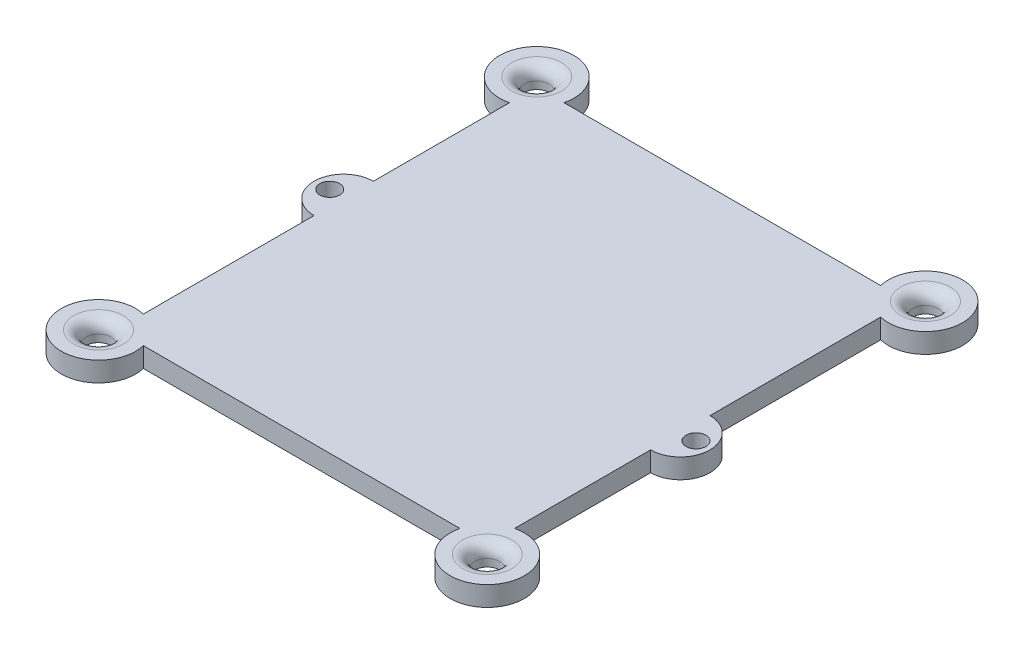
ISO-10303-21;
HEADER;
FILE_DESCRIPTION(('STEP AP214'),'2;1');
FILE_NAME('part.step','',(''),(''),'','','');
FILE_SCHEMA(('AUTOMOTIVE_DESIGN { 1 0 10303 214 1 1 1 1 }'));
ENDSEC;
DATA;
#1=APPLICATION_CONTEXT('core data for automotive mechanical design processes');
#2=APPLICATION_PROTOCOL_DEFINITION('international standard','automotive_design',2000,#1);
#3=PRODUCT_CONTEXT('',#1,'mechanical');
#4=PRODUCT('Part','Part','',(#3));
#5=PRODUCT_RELATED_PRODUCT_CATEGORY('part','',(#4));
#6=PRODUCT_DEFINITION_FORMATION('','',#4);
#7=PRODUCT_DEFINITION_CONTEXT('part definition',#1,'design');
#8=PRODUCT_DEFINITION('design','',#6,#7);
#9=PRODUCT_DEFINITION_SHAPE('','',#8);
#10=(LENGTH_UNIT() NAMED_UNIT(*) SI_UNIT(.MILLI.,.METRE.));
#11=(NAMED_UNIT(*) PLANE_ANGLE_UNIT() SI_UNIT($,.RADIAN.));
#12=(NAMED_UNIT(*) SI_UNIT($,.STERADIAN.) SOLID_ANGLE_UNIT());
#13=UNCERTAINTY_MEASURE_WITH_UNIT(LENGTH_MEASURE(1.E-05),#10,'distance_accuracy_value','');
#14=(GEOMETRIC_REPRESENTATION_CONTEXT(3) GLOBAL_UNCERTAINTY_ASSIGNED_CONTEXT((#13)) GLOBAL_UNIT_ASSIGNED_CONTEXT((#10,
#11,#12)) REPRESENTATION_CONTEXT('',''));
#15=CARTESIAN_POINT('',(0.,0.,0.));
#16=DIRECTION('',(0.,0.,1.));
#17=DIRECTION('',(1.,0.,0.));
#18=AXIS2_PLACEMENT_3D('',#15,#16,#17);
#19=CARTESIAN_POINT('',(0.,5.08,7.01157210279963));
#20=DIRECTION('',(-1.,0.,0.));
#21=DIRECTION('',(0.,0.,1.));
#22=AXIS2_PLACEMENT_3D('',#19,#20,#21);
#23=PLANE('',#22);
#24=DIRECTION('',(0.,-1.,0.));
#25=VECTOR('',#24,1.);
#26=CARTESIAN_POINT('',(0.,5.07999999999999,50.8));
#27=LINE('',#26,#25);
#28=CARTESIAN_POINT('',(0.,5.08,50.8));
#29=VERTEX_POINT('',#28);
#30=CARTESIAN_POINT('',(0.,0.,50.8));
#31=VERTEX_POINT('',#30);
#32=EDGE_CURVE('E48',#29,#31,#27,.T.);
#33=ORIENTED_EDGE('',*,*,#32,.T.);
#34=DIRECTION('',(0.,0.,-1.));
#35=VECTOR('',#34,1.);
#36=CARTESIAN_POINT('',(0.,0.,7.01157210279963));
#37=LINE('',#36,#35);
#38=CARTESIAN_POINT('',(0.,0.,7.01157210279962));
#39=VERTEX_POINT('',#38);
#40=EDGE_CURVE('E168',#31,#39,#37,.T.);
#41=ORIENTED_EDGE('',*,*,#40,.T.);
#42=DIRECTION('',(0.,-1.,0.));
#43=VECTOR('',#42,1.);
#44=CARTESIAN_POINT('',(0.,5.08,7.01157210279962));
#45=LINE('',#44,#43);
#46=CARTESIAN_POINT('',(0.,5.08,7.01157210279962));
#47=VERTEX_POINT('',#46);
#48=EDGE_CURVE('E180',#47,#39,#45,.T.);
#49=ORIENTED_EDGE('',*,*,#48,.F.);
#50=DIRECTION('',(0.,0.,-1.));
#51=VECTOR('',#50,1.);
#52=CARTESIAN_POINT('',(0.,5.08,7.01157210279963));
#53=LINE('',#52,#51);
#54=EDGE_CURVE('E145',#29,#47,#53,.T.);
#55=ORIENTED_EDGE('',*,*,#54,.F.);
#56=EDGE_LOOP('',(#33,#41,#49,#55));
#57=FACE_BOUND('',#56,.T.);
#58=ADVANCED_FACE('F33',(#57),#23,.F.);
#59=DIRECTION('',(0.,-1.,0.));
#60=VECTOR('',#59,1.);
#61=CARTESIAN_POINT('',(0.,5.07999999999999,66.04));
#62=LINE('',#61,#60);
#63=CARTESIAN_POINT('',(0.,5.07999999999999,66.04));
#64=VERTEX_POINT('',#63);
#65=CARTESIAN_POINT('',(0.,0.,66.04));
#66=VERTEX_POINT('',#65);
#67=EDGE_CURVE('E123',#64,#66,#62,.T.);
#68=ORIENTED_EDGE('',*,*,#67,.F.);
#69=CARTESIAN_POINT('',(1.6108958903037E-13,5.08,100.938427897202));
#70=VERTEX_POINT('',#69);
#71=EDGE_CURVE('E134',#70,#64,#53,.T.);
#72=ORIENTED_EDGE('',*,*,#71,.F.);
#73=DIRECTION('',(0.,-1.,0.));
#74=VECTOR('',#73,1.);
#75=CARTESIAN_POINT('',(1.6108958903037E-13,5.08,100.938427897202));
#76=LINE('',#75,#74);
#77=CARTESIAN_POINT('',(1.6108958903037E-13,0.,100.938427897202));
#78=VERTEX_POINT('',#77);
#79=EDGE_CURVE('E183',#70,#78,#76,.T.);
#80=ORIENTED_EDGE('',*,*,#79,.T.);
#81=EDGE_CURVE('E136',#78,#66,#37,.T.);
#82=ORIENTED_EDGE('',*,*,#81,.T.);
#83=EDGE_LOOP('',(#68,#72,#80,#82));
#84=FACE_BOUND('',#83,.T.);
#85=ADVANCED_FACE('F132',(#84),#23,.F.);
#86=CARTESIAN_POINT('',(-95.25,5.08,7.0115721027999));
#87=DIRECTION('',(1.,0.,0.));
#88=DIRECTION('',(0.,0.,-1.));
#89=AXIS2_PLACEMENT_3D('',#86,#87,#88);
#90=PLANE('',#89);
#91=DIRECTION('',(0.,1.,0.));
#92=VECTOR('',#91,1.);
#93=CARTESIAN_POINT('',(-95.2499999999999,5.08,41.91));
#94=LINE('',#93,#92);
#95=CARTESIAN_POINT('',(-95.2499999999999,0.,41.91));
#96=VERTEX_POINT('',#95);
#97=CARTESIAN_POINT('',(-95.2499999999999,5.08,41.91));
#98=VERTEX_POINT('',#97);
#99=EDGE_CURVE('E312',#96,#98,#94,.T.);
#100=ORIENTED_EDGE('',*,*,#99,.T.);
#101=DIRECTION('',(0.,0.,1.));
#102=VECTOR('',#101,1.);
#103=CARTESIAN_POINT('',(-95.25,5.08,7.0115721027999));
#104=LINE('',#103,#102);
#105=CARTESIAN_POINT('',(-95.25,5.08,7.0115721027999));
#106=VERTEX_POINT('',#105);
#107=EDGE_CURVE('E296',#106,#98,#104,.T.);
#108=ORIENTED_EDGE('',*,*,#107,.F.);
#109=DIRECTION('',(0.,-1.,0.));
#110=VECTOR('',#109,1.);
#111=CARTESIAN_POINT('',(-95.25,5.08,7.0115721027999));
#112=LINE('',#111,#110);
#113=CARTESIAN_POINT('',(-95.25,0.,7.0115721027999));
#114=VERTEX_POINT('',#113);
#115=EDGE_CURVE('E194',#106,#114,#112,.T.);
#116=ORIENTED_EDGE('',*,*,#115,.T.);
#117=DIRECTION('',(0.,0.,1.));
#118=VECTOR('',#117,1.);
#119=CARTESIAN_POINT('',(-95.25,0.,7.0115721027999));
#120=LINE('',#119,#118);
#121=EDGE_CURVE('E159',#114,#96,#120,.T.);
#122=ORIENTED_EDGE('',*,*,#121,.T.);
#123=EDGE_LOOP('',(#100,#108,#116,#122));
#124=FACE_BOUND('',#123,.T.);
#125=ADVANCED_FACE('F239',(#124),#90,.F.);
#126=DIRECTION('',(0.,1.,0.));
#127=VECTOR('',#126,1.);
#128=CARTESIAN_POINT('',(-95.25,5.08,57.15));
#129=LINE('',#128,#127);
#130=CARTESIAN_POINT('',(-95.25,0.,57.15));
#131=VERTEX_POINT('',#130);
#132=CARTESIAN_POINT('',(-95.25,5.08,57.15));
#133=VERTEX_POINT('',#132);
#134=EDGE_CURVE('E56',#131,#133,#129,.T.);
#135=ORIENTED_EDGE('',*,*,#134,.F.);
#136=CARTESIAN_POINT('',(-95.25,0.,100.9384278972));
#137=VERTEX_POINT('',#136);
#138=EDGE_CURVE('E157',#131,#137,#120,.T.);
#139=ORIENTED_EDGE('',*,*,#138,.T.);
#140=DIRECTION('',(0.,-1.,0.));
#141=VECTOR('',#140,1.);
#142=CARTESIAN_POINT('',(-95.25,5.08,100.9384278972));
#143=LINE('',#142,#141);
#144=CARTESIAN_POINT('',(-95.25,5.08,100.9384278972));
#145=VERTEX_POINT('',#144);
#146=EDGE_CURVE('E191',#145,#137,#143,.T.);
#147=ORIENTED_EDGE('',*,*,#146,.F.);
#148=EDGE_CURVE('E295',#133,#145,#104,.T.);
#149=ORIENTED_EDGE('',*,*,#148,.F.);
#150=EDGE_LOOP('',(#135,#139,#147,#149));
#151=FACE_BOUND('',#150,.T.);
#152=ADVANCED_FACE('F259',(#151),#90,.F.);
#153=CARTESIAN_POINT('',(-97.4950640302662,5.08,-2.24506403026728));
#154=DIRECTION('',(0.,1.,0.));
#155=DIRECTION('',(0.,0.,1.));
#156=AXIS2_PLACEMENT_3D('',#153,#154,#155);
#157=PLANE('',#156);
#158=CARTESIAN_POINT('',(-97.4950640302662,5.08,-2.24506403026728));
#159=DIRECTION('',(0.,1.,0.));
#160=DIRECTION('',(0.,0.,1.));
#161=AXIS2_PLACEMENT_3D('',#158,#159,#160);
#162=CIRCLE('',#161,6.34999999999894);
#163=CARTESIAN_POINT('',(-97.4950640302662,5.08,4.10493596973166));
#164=VERTEX_POINT('',#163);
#165=EDGE_CURVE('E209',#164,#164,#162,.F.);
#166=ORIENTED_EDGE('',*,*,#165,.T.);
#167=EDGE_LOOP('',(#166));
#168=FACE_BOUND('',#167,.T.);
#169=CARTESIAN_POINT('',(2.24506403026729,5.08,-2.24506403026728));
#170=DIRECTION('',(0.,1.,0.));
#171=DIRECTION('',(0.,0.,1.));
#172=AXIS2_PLACEMENT_3D('',#169,#170,#171);
#173=CIRCLE('',#172,6.35);
#174=CARTESIAN_POINT('',(2.24506403026729,5.08,4.10493596973272));
#175=VERTEX_POINT('',#174);
#176=EDGE_CURVE('E206',#175,#175,#173,.F.);
#177=ORIENTED_EDGE('',*,*,#176,.T.);
#178=EDGE_LOOP('',(#177));
#179=FACE_BOUND('',#178,.T.);
#180=CARTESIAN_POINT('',(-97.4950640302673,5.08,110.195064030267));
#181=DIRECTION('',(0.,1.,0.));
#182=DIRECTION('',(0.,0.,1.));
#183=AXIS2_PLACEMENT_3D('',#180,#181,#182);
#184=CIRCLE('',#183,6.35000000000003);
#185=CARTESIAN_POINT('',(-97.4950640302673,5.08,116.545064030267));
#186=VERTEX_POINT('',#185);
#187=EDGE_CURVE('E203',#186,#186,#184,.F.);
#188=ORIENTED_EDGE('',*,*,#187,.T.);
#189=EDGE_LOOP('',(#188));
#190=FACE_BOUND('',#189,.T.);
#191=CARTESIAN_POINT('',(2.24506403026728,5.08,110.195064030269));
#192=DIRECTION('',(0.,1.,0.));
#193=DIRECTION('',(0.,0.,1.));
#194=AXIS2_PLACEMENT_3D('',#191,#192,#193);
#195=CIRCLE('',#194,6.35000000000043);
#196=CARTESIAN_POINT('',(2.24506403026728,5.08,116.545064030269));
#197=VERTEX_POINT('',#196);
#198=EDGE_CURVE('E200',#197,#197,#195,.F.);
#199=ORIENTED_EDGE('',*,*,#198,.T.);
#200=EDGE_LOOP('',(#199));
#201=FACE_BOUND('',#200,.T.);
#202=CARTESIAN_POINT('',(3.80445065816905,5.08,58.2144393287687));
#203=DIRECTION('',(0.,1.,0.));
#204=DIRECTION('',(0.,0.,1.));
#205=AXIS2_PLACEMENT_3D('',#202,#203,#204);
#206=CIRCLE('',#205,2.54000000000072);
#207=CARTESIAN_POINT('',(3.80445065816905,5.08,60.7544393287695));
#208=VERTEX_POINT('',#207);
#209=EDGE_CURVE('E371',#208,#208,#206,.T.);
#210=ORIENTED_EDGE('',*,*,#209,.F.);
#211=EDGE_LOOP('',(#210));
#212=FACE_BOUND('',#211,.T.);
#213=CARTESIAN_POINT('',(-99.053632382932,5.08,49.3098166774913));
#214=DIRECTION('',(0.,1.,0.));
#215=DIRECTION('',(0.,0.,1.));
#216=AXIS2_PLACEMENT_3D('',#213,#214,#215);
#217=CIRCLE('',#216,2.54);
#218=CARTESIAN_POINT('',(-99.053632382932,5.08,51.8498166774913));
#219=VERTEX_POINT('',#218);
#220=EDGE_CURVE('E365',#219,#219,#217,.T.);
#221=ORIENTED_EDGE('',*,*,#220,.F.);
#222=EDGE_LOOP('',(#221));
#223=FACE_BOUND('',#222,.T.);
#224=CARTESIAN_POINT('',(-97.4950640302662,5.08,-2.24506403026728));
#225=DIRECTION('',(0.,1.,0.));
#226=DIRECTION('',(0.,0.,1.));
#227=AXIS2_PLACEMENT_3D('',#224,#225,#226);
#228=CIRCLE('',#227,9.525);
#229=CARTESIAN_POINT('',(-88.2384278971993,5.08,0.));
#230=VERTEX_POINT('',#229);
#231=EDGE_CURVE('E174',#230,#106,#228,.T.);
#232=ORIENTED_EDGE('',*,*,#231,.T.);
#233=ORIENTED_EDGE('',*,*,#107,.T.);
#234=CARTESIAN_POINT('',(-95.25,5.08,49.53));
#235=DIRECTION('',(0.,1.,0.));
#236=DIRECTION('',(0.,0.,1.));
#237=AXIS2_PLACEMENT_3D('',#234,#235,#236);
#238=CIRCLE('',#237,7.62);
#239=EDGE_CURVE('E318',#98,#133,#238,.T.);
#240=ORIENTED_EDGE('',*,*,#239,.T.);
#241=ORIENTED_EDGE('',*,*,#148,.T.);
#242=CARTESIAN_POINT('',(-97.4950640302673,5.08,110.195064030267));
#243=DIRECTION('',(0.,1.,0.));
#244=DIRECTION('',(0.,0.,1.));
#245=AXIS2_PLACEMENT_3D('',#242,#243,#244);
#246=CIRCLE('',#245,9.525);
#247=CARTESIAN_POINT('',(-88.2384278972004,5.08,107.95));
#248=VERTEX_POINT('',#247);
#249=EDGE_CURVE('E299',#145,#248,#246,.T.);
#250=ORIENTED_EDGE('',*,*,#249,.T.);
#251=DIRECTION('',(1.,0.,0.));
#252=VECTOR('',#251,1.);
#253=CARTESIAN_POINT('',(-7.01157210279928,5.08,107.95));
#254=LINE('',#253,#252);
#255=CARTESIAN_POINT('',(-7.01157210279928,5.08,107.95));
#256=VERTEX_POINT('',#255);
#257=EDGE_CURVE('E300',#248,#256,#254,.T.);
#258=ORIENTED_EDGE('',*,*,#257,.T.);
#259=CARTESIAN_POINT('',(2.24506403026728,5.08,110.195064030269));
#260=DIRECTION('',(0.,1.,0.));
#261=DIRECTION('',(0.,0.,1.));
#262=AXIS2_PLACEMENT_3D('',#259,#260,#261);
#263=CIRCLE('',#262,9.525);
#264=EDGE_CURVE('E142',#256,#70,#263,.T.);
#265=ORIENTED_EDGE('',*,*,#264,.T.);
#266=ORIENTED_EDGE('',*,*,#71,.T.);
#267=CARTESIAN_POINT('',(0.,5.07999999999999,58.42));
#268=DIRECTION('',(0.,-1.,0.));
#269=DIRECTION('',(0.,0.,-1.));
#270=AXIS2_PLACEMENT_3D('',#267,#268,#269);
#271=CIRCLE('',#270,7.61999999999997);
#272=EDGE_CURVE('E120',#29,#64,#271,.T.);
#273=ORIENTED_EDGE('',*,*,#272,.F.);
#274=ORIENTED_EDGE('',*,*,#54,.T.);
#275=CARTESIAN_POINT('',(2.24506403026729,5.08,-2.24506403026728));
#276=DIRECTION('',(0.,1.,0.));
#277=DIRECTION('',(0.,0.,1.));
#278=AXIS2_PLACEMENT_3D('',#275,#276,#277);
#279=CIRCLE('',#278,9.525);
#280=CARTESIAN_POINT('',(-7.01157210279962,5.08,0.));
#281=VERTEX_POINT('',#280);
#282=EDGE_CURVE('E144',#47,#281,#279,.T.);
#283=ORIENTED_EDGE('',*,*,#282,.T.);
#284=DIRECTION('',(-1.,0.,0.));
#285=VECTOR('',#284,1.);
#286=CARTESIAN_POINT('',(-7.01157210279962,5.08,0.));
#287=LINE('',#286,#285);
#288=EDGE_CURVE('E147',#281,#230,#287,.T.);
#289=ORIENTED_EDGE('',*,*,#288,.T.);
#290=EDGE_LOOP('',(#232,#233,#240,#241,#250,#258,#265,#266,#273,#274,#283,#289));
#291=FACE_BOUND('',#290,.T.);
#292=ADVANCED_FACE('F140',(#168,#179,#190,#201,#212,#223,#291),#157,.T.);
#293=CARTESIAN_POINT('',(-97.4950640302662,0.,-2.24506403026728));
#294=DIRECTION('',(0.,1.,0.));
#295=DIRECTION('',(0.,0.,1.));
#296=AXIS2_PLACEMENT_3D('',#293,#294,#295);
#297=PLANE('',#296);
#298=CARTESIAN_POINT('',(3.80445065816905,0.,58.2144393287687));
#299=DIRECTION('',(0.,1.,0.));
#300=DIRECTION('',(0.,0.,1.));
#301=AXIS2_PLACEMENT_3D('',#298,#299,#300);
#302=CIRCLE('',#301,2.54000000000072);
#303=CARTESIAN_POINT('',(3.80445065816905,0.,60.7544393287695));
#304=VERTEX_POINT('',#303);
#305=EDGE_CURVE('E368',#304,#304,#302,.T.);
#306=ORIENTED_EDGE('',*,*,#305,.T.);
#307=EDGE_LOOP('',(#306));
#308=FACE_BOUND('',#307,.T.);
#309=CARTESIAN_POINT('',(-99.053632382932,0.,49.3098166774913));
#310=DIRECTION('',(0.,1.,0.));
#311=DIRECTION('',(0.,0.,1.));
#312=AXIS2_PLACEMENT_3D('',#309,#310,#311);
#313=CIRCLE('',#312,2.54);
#314=CARTESIAN_POINT('',(-99.053632382932,0.,51.8498166774913));
#315=VERTEX_POINT('',#314);
#316=EDGE_CURVE('E137',#315,#315,#313,.T.);
#317=ORIENTED_EDGE('',*,*,#316,.T.);
#318=EDGE_LOOP('',(#317));
#319=FACE_BOUND('',#318,.T.);
#320=CARTESIAN_POINT('',(-97.4950640302662,0.,-2.24506403026728));
#321=DIRECTION('',(0.,1.,0.));
#322=DIRECTION('',(0.,0.,1.));
#323=AXIS2_PLACEMENT_3D('',#320,#321,#322);
#324=CIRCLE('',#323,9.525);
#325=CARTESIAN_POINT('',(-88.2384278971993,0.,0.));
#326=VERTEX_POINT('',#325);
#327=EDGE_CURVE('E154',#326,#114,#324,.T.);
#328=ORIENTED_EDGE('',*,*,#327,.F.);
#329=DIRECTION('',(-1.,0.,0.));
#330=VECTOR('',#329,1.);
#331=CARTESIAN_POINT('',(-7.01157210279962,0.,0.));
#332=LINE('',#331,#330);
#333=CARTESIAN_POINT('',(-7.01157210279962,0.,0.));
#334=VERTEX_POINT('',#333);
#335=EDGE_CURVE('E172',#334,#326,#332,.T.);
#336=ORIENTED_EDGE('',*,*,#335,.F.);
#337=CARTESIAN_POINT('',(2.24506403026729,0.,-2.24506403026728));
#338=DIRECTION('',(0.,1.,0.));
#339=DIRECTION('',(0.,0.,1.));
#340=AXIS2_PLACEMENT_3D('',#337,#338,#339);
#341=CIRCLE('',#340,9.525);
#342=EDGE_CURVE('E170',#39,#334,#341,.T.);
#343=ORIENTED_EDGE('',*,*,#342,.F.);
#344=ORIENTED_EDGE('',*,*,#40,.F.);
#345=CARTESIAN_POINT('',(0.,0.,58.42));
#346=DIRECTION('',(0.,-1.,0.));
#347=DIRECTION('',(0.,0.,-1.));
#348=AXIS2_PLACEMENT_3D('',#345,#346,#347);
#349=CIRCLE('',#348,7.61999999999997);
#350=EDGE_CURVE('E128',#31,#66,#349,.T.);
#351=ORIENTED_EDGE('',*,*,#350,.T.);
#352=ORIENTED_EDGE('',*,*,#81,.F.);
#353=CARTESIAN_POINT('',(2.24506403026728,0.,110.195064030269));
#354=DIRECTION('',(0.,1.,0.));
#355=DIRECTION('',(0.,0.,1.));
#356=AXIS2_PLACEMENT_3D('',#353,#354,#355);
#357=CIRCLE('',#356,9.525);
#358=CARTESIAN_POINT('',(-7.01157210279928,0.,107.95));
#359=VERTEX_POINT('',#358);
#360=EDGE_CURVE('E166',#359,#78,#357,.T.);
#361=ORIENTED_EDGE('',*,*,#360,.F.);
#362=DIRECTION('',(1.,0.,0.));
#363=VECTOR('',#362,1.);
#364=CARTESIAN_POINT('',(-7.01157210279928,0.,107.95));
#365=LINE('',#364,#363);
#366=CARTESIAN_POINT('',(-88.2384278972004,0.,107.95));
#367=VERTEX_POINT('',#366);
#368=EDGE_CURVE('E164',#367,#359,#365,.T.);
#369=ORIENTED_EDGE('',*,*,#368,.F.);
#370=CARTESIAN_POINT('',(-97.4950640302673,0.,110.195064030267));
#371=DIRECTION('',(0.,1.,0.));
#372=DIRECTION('',(0.,0.,1.));
#373=AXIS2_PLACEMENT_3D('',#370,#371,#372);
#374=CIRCLE('',#373,9.525);
#375=EDGE_CURVE('E162',#137,#367,#374,.T.);
#376=ORIENTED_EDGE('',*,*,#375,.F.);
#377=ORIENTED_EDGE('',*,*,#138,.F.);
#378=CARTESIAN_POINT('',(-95.25,0.,49.53));
#379=DIRECTION('',(0.,1.,0.));
#380=DIRECTION('',(0.,0.,1.));
#381=AXIS2_PLACEMENT_3D('',#378,#379,#380);
#382=CIRCLE('',#381,7.62);
#383=EDGE_CURVE('E320',#96,#131,#382,.T.);
#384=ORIENTED_EDGE('',*,*,#383,.F.);
#385=ORIENTED_EDGE('',*,*,#121,.F.);
#386=EDGE_LOOP('',(#328,#336,#343,#344,#351,#352,#361,#369,#376,#377,#384,#385));
#387=FACE_BOUND('',#386,.T.);
#388=CARTESIAN_POINT('',(-97.4950640302662,0.,-2.24506403026728));
#389=DIRECTION('',(0.,1.,0.));
#390=DIRECTION('',(0.,0.,1.));
#391=AXIS2_PLACEMENT_3D('',#388,#389,#390);
#392=CIRCLE('',#391,3.17499999999894);
#393=CARTESIAN_POINT('',(-97.4950640302662,0.,0.929935969731661));
#394=VERTEX_POINT('',#393);
#395=EDGE_CURVE('E158',#394,#394,#392,.T.);
#396=ORIENTED_EDGE('',*,*,#395,.T.);
#397=EDGE_LOOP('',(#396));
#398=FACE_BOUND('',#397,.T.);
#399=CARTESIAN_POINT('',(2.24506403026729,0.,-2.24506403026728));
#400=DIRECTION('',(0.,1.,0.));
#401=DIRECTION('',(0.,0.,1.));
#402=AXIS2_PLACEMENT_3D('',#399,#400,#401);
#403=CIRCLE('',#402,3.175);
#404=CARTESIAN_POINT('',(2.24506403026729,0.,0.929935969732717));
#405=VERTEX_POINT('',#404);
#406=EDGE_CURVE('E287',#405,#405,#403,.T.);
#407=ORIENTED_EDGE('',*,*,#406,.T.);
#408=EDGE_LOOP('',(#407));
#409=FACE_BOUND('',#408,.T.);
#410=CARTESIAN_POINT('',(2.24506403026728,0.,110.195064030269));
#411=DIRECTION('',(0.,1.,0.));
#412=DIRECTION('',(0.,0.,1.));
#413=AXIS2_PLACEMENT_3D('',#410,#411,#412);
#414=CIRCLE('',#413,3.17500000000043);
#415=CARTESIAN_POINT('',(2.24506403026728,0.,113.370064030269));
#416=VERTEX_POINT('',#415);
#417=EDGE_CURVE('E290',#416,#416,#414,.T.);
#418=ORIENTED_EDGE('',*,*,#417,.T.);
#419=EDGE_LOOP('',(#418));
#420=FACE_BOUND('',#419,.T.);
#421=CARTESIAN_POINT('',(-97.4950640302673,0.,110.195064030267));
#422=DIRECTION('',(0.,1.,0.));
#423=DIRECTION('',(0.,0.,1.));
#424=AXIS2_PLACEMENT_3D('',#421,#422,#423);
#425=CIRCLE('',#424,3.17500000000003);
#426=CARTESIAN_POINT('',(-97.4950640302673,0.,113.370064030267));
#427=VERTEX_POINT('',#426);
#428=EDGE_CURVE('E322',#427,#427,#425,.T.);
#429=ORIENTED_EDGE('',*,*,#428,.T.);
#430=EDGE_LOOP('',(#429));
#431=FACE_BOUND('',#430,.T.);
#432=ADVANCED_FACE('F263',(#308,#319,#387,#398,#409,#420,#431),#297,.F.);
#433=CARTESIAN_POINT('',(-97.4950640302662,5.08,-2.24506403026728));
#434=DIRECTION('',(0.,-1.,0.));
#435=DIRECTION('',(0.,0.,-1.));
#436=AXIS2_PLACEMENT_3D('',#433,#434,#435);
#437=CYLINDRICAL_SURFACE('',#436,9.525);
#438=ORIENTED_EDGE('',*,*,#327,.T.);
#439=ORIENTED_EDGE('',*,*,#115,.F.);
#440=ORIENTED_EDGE('',*,*,#231,.F.);
#441=DIRECTION('',(0.,-1.,0.));
#442=VECTOR('',#441,1.);
#443=CARTESIAN_POINT('',(-88.2384278971993,5.08,0.));
#444=LINE('',#443,#442);
#445=EDGE_CURVE('E153',#230,#326,#444,.T.);
#446=ORIENTED_EDGE('',*,*,#445,.T.);
#447=EDGE_LOOP('',(#438,#439,#440,#446));
#448=FACE_BOUND('',#447,.T.);
#449=ADVANCED_FACE('F255',(#448),#437,.T.);
#450=CARTESIAN_POINT('',(-97.4950640302673,5.08,110.195064030267));
#451=DIRECTION('',(0.,-1.,0.));
#452=DIRECTION('',(0.,0.,-1.));
#453=AXIS2_PLACEMENT_3D('',#450,#451,#452);
#454=CYLINDRICAL_SURFACE('',#453,9.525);
#455=ORIENTED_EDGE('',*,*,#375,.T.);
#456=DIRECTION('',(0.,-1.,0.));
#457=VECTOR('',#456,1.);
#458=CARTESIAN_POINT('',(-88.2384278972004,5.08,107.95));
#459=LINE('',#458,#457);
#460=EDGE_CURVE('E188',#248,#367,#459,.T.);
#461=ORIENTED_EDGE('',*,*,#460,.F.);
#462=ORIENTED_EDGE('',*,*,#249,.F.);
#463=ORIENTED_EDGE('',*,*,#146,.T.);
#464=EDGE_LOOP('',(#455,#461,#462,#463));
#465=FACE_BOUND('',#464,.T.);
#466=ADVANCED_FACE('F251',(#465),#454,.T.);
#467=CARTESIAN_POINT('',(-7.01157210279928,5.08,107.95));
#468=DIRECTION('',(0.,0.,-1.));
#469=DIRECTION('',(-1.,0.,0.));
#470=AXIS2_PLACEMENT_3D('',#467,#468,#469);
#471=PLANE('',#470);
#472=ORIENTED_EDGE('',*,*,#368,.T.);
#473=DIRECTION('',(0.,-1.,0.));
#474=VECTOR('',#473,1.);
#475=CARTESIAN_POINT('',(-7.01157210279928,5.08,107.95));
#476=LINE('',#475,#474);
#477=EDGE_CURVE('E185',#256,#359,#476,.T.);
#478=ORIENTED_EDGE('',*,*,#477,.F.);
#479=ORIENTED_EDGE('',*,*,#257,.F.);
#480=ORIENTED_EDGE('',*,*,#460,.T.);
#481=EDGE_LOOP('',(#472,#478,#479,#480));
#482=FACE_BOUND('',#481,.T.);
#483=ADVANCED_FACE('F247',(#482),#471,.F.);
#484=CARTESIAN_POINT('',(2.24506403026728,5.08,110.195064030269));
#485=DIRECTION('',(0.,-1.,0.));
#486=DIRECTION('',(0.,0.,-1.));
#487=AXIS2_PLACEMENT_3D('',#484,#485,#486);
#488=CYLINDRICAL_SURFACE('',#487,9.525);
#489=ORIENTED_EDGE('',*,*,#360,.T.);
#490=ORIENTED_EDGE('',*,*,#79,.F.);
#491=ORIENTED_EDGE('',*,*,#264,.F.);
#492=ORIENTED_EDGE('',*,*,#477,.T.);
#493=EDGE_LOOP('',(#489,#490,#491,#492));
#494=FACE_BOUND('',#493,.T.);
#495=ADVANCED_FACE('F244',(#494),#488,.T.);
#496=CARTESIAN_POINT('',(2.24506403026729,5.08,-2.24506403026728));
#497=DIRECTION('',(0.,-1.,0.));
#498=DIRECTION('',(0.,0.,-1.));
#499=AXIS2_PLACEMENT_3D('',#496,#497,#498);
#500=CYLINDRICAL_SURFACE('',#499,9.525);
#501=ORIENTED_EDGE('',*,*,#342,.T.);
#502=DIRECTION('',(0.,-1.,0.));
#503=VECTOR('',#502,1.);
#504=CARTESIAN_POINT('',(-7.01157210279962,5.08,0.));
#505=LINE('',#504,#503);
#506=EDGE_CURVE('E177',#281,#334,#505,.T.);
#507=ORIENTED_EDGE('',*,*,#506,.F.);
#508=ORIENTED_EDGE('',*,*,#282,.F.);
#509=ORIENTED_EDGE('',*,*,#48,.T.);
#510=EDGE_LOOP('',(#501,#507,#508,#509));
#511=FACE_BOUND('',#510,.T.);
#512=ADVANCED_FACE('F242',(#511),#500,.T.);
#513=CARTESIAN_POINT('',(-7.01157210279962,5.08,0.));
#514=DIRECTION('',(0.,0.,1.));
#515=DIRECTION('',(1.,0.,0.));
#516=AXIS2_PLACEMENT_3D('',#513,#514,#515);
#517=PLANE('',#516);
#518=ORIENTED_EDGE('',*,*,#335,.T.);
#519=ORIENTED_EDGE('',*,*,#445,.F.);
#520=ORIENTED_EDGE('',*,*,#288,.F.);
#521=ORIENTED_EDGE('',*,*,#506,.T.);
#522=EDGE_LOOP('',(#518,#519,#520,#521));
#523=FACE_BOUND('',#522,.T.);
#524=ADVANCED_FACE('F282',(#523),#517,.F.);
#525=CARTESIAN_POINT('',(-97.4950640302662,5.08,-2.24506403026728));
#526=DIRECTION('',(0.,-1.,0.));
#527=DIRECTION('',(0.,0.,-1.));
#528=AXIS2_PLACEMENT_3D('',#525,#526,#527);
#529=CYLINDRICAL_SURFACE('',#528,3.17499999999894);
#530=CARTESIAN_POINT('',(-97.4950640302662,1.905,-2.24506403026728));
#531=DIRECTION('',(0.,1.,0.));
#532=DIRECTION('',(0.,0.,1.));
#533=AXIS2_PLACEMENT_3D('',#530,#531,#532);
#534=CIRCLE('',#533,3.17499999999894);
#535=CARTESIAN_POINT('',(-97.4950640302662,1.905,0.929935969731661));
#536=VERTEX_POINT('',#535);
#537=EDGE_CURVE('E197',#536,#536,#534,.T.);
#538=ORIENTED_EDGE('',*,*,#537,.T.);
#539=EDGE_LOOP('',(#538));
#540=FACE_BOUND('',#539,.T.);
#541=ORIENTED_EDGE('',*,*,#395,.F.);
#542=EDGE_LOOP('',(#541));
#543=FACE_BOUND('',#542,.T.);
#544=ADVANCED_FACE('F278',(#540,#543),#529,.F.);
#545=CARTESIAN_POINT('',(2.24506403026729,5.08,-2.24506403026728));
#546=DIRECTION('',(0.,-1.,0.));
#547=DIRECTION('',(0.,0.,-1.));
#548=AXIS2_PLACEMENT_3D('',#545,#546,#547);
#549=CYLINDRICAL_SURFACE('',#548,3.175);
#550=CARTESIAN_POINT('',(2.24506403026729,1.905,-2.24506403026728));
#551=DIRECTION('',(0.,1.,0.));
#552=DIRECTION('',(0.,0.,1.));
#553=AXIS2_PLACEMENT_3D('',#550,#551,#552);
#554=CIRCLE('',#553,3.175);
#555=CARTESIAN_POINT('',(2.24506403026729,1.905,0.929935969732717));
#556=VERTEX_POINT('',#555);
#557=EDGE_CURVE('E212',#556,#556,#554,.T.);
#558=ORIENTED_EDGE('',*,*,#557,.T.);
#559=EDGE_LOOP('',(#558));
#560=FACE_BOUND('',#559,.T.);
#561=ORIENTED_EDGE('',*,*,#406,.F.);
#562=EDGE_LOOP('',(#561));
#563=FACE_BOUND('',#562,.T.);
#564=ADVANCED_FACE('F281',(#560,#563),#549,.F.);
#565=CARTESIAN_POINT('',(2.24506403026728,5.08,110.195064030269));
#566=DIRECTION('',(0.,-1.,0.));
#567=DIRECTION('',(0.,0.,-1.));
#568=AXIS2_PLACEMENT_3D('',#565,#566,#567);
#569=CYLINDRICAL_SURFACE('',#568,3.17500000000043);
#570=CARTESIAN_POINT('',(2.24506403026728,1.905,110.195064030269));
#571=DIRECTION('',(0.,1.,0.));
#572=DIRECTION('',(0.,0.,1.));
#573=AXIS2_PLACEMENT_3D('',#570,#571,#572);
#574=CIRCLE('',#573,3.17500000000043);
#575=CARTESIAN_POINT('',(2.24506403026728,1.905,113.370064030269));
#576=VERTEX_POINT('',#575);
#577=EDGE_CURVE('E11',#576,#576,#574,.T.);
#578=ORIENTED_EDGE('',*,*,#577,.T.);
#579=EDGE_LOOP('',(#578));
#580=FACE_BOUND('',#579,.T.);
#581=ORIENTED_EDGE('',*,*,#417,.F.);
#582=EDGE_LOOP('',(#581));
#583=FACE_BOUND('',#582,.T.);
#584=ADVANCED_FACE('F329',(#580,#583),#569,.F.);
#585=CARTESIAN_POINT('',(-97.4950640302673,5.08,110.195064030267));
#586=DIRECTION('',(0.,-1.,0.));
#587=DIRECTION('',(0.,0.,-1.));
#588=AXIS2_PLACEMENT_3D('',#585,#586,#587);
#589=CYLINDRICAL_SURFACE('',#588,3.17500000000003);
#590=CARTESIAN_POINT('',(-97.4950640302673,1.905,110.195064030267));
#591=DIRECTION('',(0.,1.,0.));
#592=DIRECTION('',(0.,0.,1.));
#593=AXIS2_PLACEMENT_3D('',#590,#591,#592);
#594=CIRCLE('',#593,3.17500000000003);
#595=CARTESIAN_POINT('',(-97.4950640302673,1.905,113.370064030267));
#596=VERTEX_POINT('',#595);
#597=EDGE_CURVE('E41',#596,#596,#594,.T.);
#598=ORIENTED_EDGE('',*,*,#597,.T.);
#599=EDGE_LOOP('',(#598));
#600=FACE_BOUND('',#599,.T.);
#601=ORIENTED_EDGE('',*,*,#428,.F.);
#602=EDGE_LOOP('',(#601));
#603=FACE_BOUND('',#602,.T.);
#604=ADVANCED_FACE('F217',(#600,#603),#589,.F.);
#605=CARTESIAN_POINT('',(-95.25,5.08,49.53));
#606=DIRECTION('',(0.,1.,0.));
#607=DIRECTION('',(0.,0.,1.));
#608=AXIS2_PLACEMENT_3D('',#605,#606,#607);
#609=CYLINDRICAL_SURFACE('',#608,7.62);
#610=ORIENTED_EDGE('',*,*,#239,.F.);
#611=ORIENTED_EDGE('',*,*,#99,.F.);
#612=ORIENTED_EDGE('',*,*,#383,.T.);
#613=ORIENTED_EDGE('',*,*,#134,.T.);
#614=EDGE_LOOP('',(#610,#611,#612,#613));
#615=FACE_BOUND('',#614,.T.);
#616=ADVANCED_FACE('F337',(#615),#609,.T.);
#617=CARTESIAN_POINT('',(0.,5.08,58.42));
#618=DIRECTION('',(0.,-1.,0.));
#619=DIRECTION('',(0.,0.,-1.));
#620=AXIS2_PLACEMENT_3D('',#617,#618,#619);
#621=CYLINDRICAL_SURFACE('',#620,7.61999999999997);
#622=ORIENTED_EDGE('',*,*,#272,.T.);
#623=ORIENTED_EDGE('',*,*,#67,.T.);
#624=ORIENTED_EDGE('',*,*,#350,.F.);
#625=ORIENTED_EDGE('',*,*,#32,.F.);
#626=EDGE_LOOP('',(#622,#623,#624,#625));
#627=FACE_BOUND('',#626,.T.);
#628=ADVANCED_FACE('F122',(#627),#621,.T.);
#629=CARTESIAN_POINT('',(-99.053632382932,0.,49.3098166774913));
#630=DIRECTION('',(0.,1.,0.));
#631=DIRECTION('',(0.,0.,1.));
#632=AXIS2_PLACEMENT_3D('',#629,#630,#631);
#633=CYLINDRICAL_SURFACE('',#632,2.54);
#634=ORIENTED_EDGE('',*,*,#316,.F.);
#635=EDGE_LOOP('',(#634));
#636=FACE_BOUND('',#635,.T.);
#637=ORIENTED_EDGE('',*,*,#220,.T.);
#638=EDGE_LOOP('',(#637));
#639=FACE_BOUND('',#638,.T.);
#640=ADVANCED_FACE('F271',(#636,#639),#633,.F.);
#641=CARTESIAN_POINT('',(3.80445065816905,0.,58.2144393287687));
#642=DIRECTION('',(0.,1.,0.));
#643=DIRECTION('',(0.,0.,1.));
#644=AXIS2_PLACEMENT_3D('',#641,#642,#643);
#645=CYLINDRICAL_SURFACE('',#644,2.54000000000072);
#646=ORIENTED_EDGE('',*,*,#305,.F.);
#647=EDGE_LOOP('',(#646));
#648=FACE_BOUND('',#647,.T.);
#649=ORIENTED_EDGE('',*,*,#209,.T.);
#650=EDGE_LOOP('',(#649));
#651=FACE_BOUND('',#650,.T.);
#652=ADVANCED_FACE('F266',(#648,#651),#645,.F.);
#653=CARTESIAN_POINT('',(-97.4950640302662,1.905,-2.24506403026728));
#654=DIRECTION('',(0.,1.,0.));
#655=DIRECTION('',(0.,0.,1.));
#656=AXIS2_PLACEMENT_3D('',#653,#654,#655);
#657=TOROIDAL_SURFACE('',#656,6.34999999999894,3.175);
#658=ORIENTED_EDGE('',*,*,#165,.F.);
#659=EDGE_LOOP('',(#658));
#660=FACE_BOUND('',#659,.T.);
#661=ORIENTED_EDGE('',*,*,#537,.F.);
#662=EDGE_LOOP('',(#661));
#663=FACE_BOUND('',#662,.T.);
#664=ADVANCED_FACE('F229',(#660,#663),#657,.T.);
#665=CARTESIAN_POINT('',(2.24506403026729,1.905,-2.24506403026728));
#666=DIRECTION('',(0.,1.,0.));
#667=DIRECTION('',(0.,0.,1.));
#668=AXIS2_PLACEMENT_3D('',#665,#666,#667);
#669=TOROIDAL_SURFACE('',#668,6.35,3.175);
#670=ORIENTED_EDGE('',*,*,#176,.F.);
#671=EDGE_LOOP('',(#670));
#672=FACE_BOUND('',#671,.T.);
#673=ORIENTED_EDGE('',*,*,#557,.F.);
#674=EDGE_LOOP('',(#673));
#675=FACE_BOUND('',#674,.T.);
#676=ADVANCED_FACE('F222',(#672,#675),#669,.T.);
#677=CARTESIAN_POINT('',(-97.4950640302673,1.905,110.195064030267));
#678=DIRECTION('',(0.,1.,0.));
#679=DIRECTION('',(0.,0.,1.));
#680=AXIS2_PLACEMENT_3D('',#677,#678,#679);
#681=TOROIDAL_SURFACE('',#680,6.35000000000003,3.175);
#682=ORIENTED_EDGE('',*,*,#187,.F.);
#683=EDGE_LOOP('',(#682));
#684=FACE_BOUND('',#683,.T.);
#685=ORIENTED_EDGE('',*,*,#597,.F.);
#686=EDGE_LOOP('',(#685));
#687=FACE_BOUND('',#686,.T.);
#688=ADVANCED_FACE('F220',(#684,#687),#681,.T.);
#689=CARTESIAN_POINT('',(2.24506403026728,1.905,110.195064030269));
#690=DIRECTION('',(0.,1.,0.));
#691=DIRECTION('',(0.,0.,1.));
#692=AXIS2_PLACEMENT_3D('',#689,#690,#691);
#693=TOROIDAL_SURFACE('',#692,6.35000000000043,3.175);
#694=ORIENTED_EDGE('',*,*,#198,.F.);
#695=EDGE_LOOP('',(#694));
#696=FACE_BOUND('',#695,.T.);
#697=ORIENTED_EDGE('',*,*,#577,.F.);
#698=EDGE_LOOP('',(#697));
#699=FACE_BOUND('',#698,.T.);
#700=ADVANCED_FACE('F35',(#696,#699),#693,.T.);
#701=CLOSED_SHELL('',(#58,#85,#125,#152,#292,#432,#449,#466,#483,#495,#512,#524,#544,#564,#584,
#604,#616,#628,#640,#652,#664,#676,#688,#700));
#702=MANIFOLD_SOLID_BREP('B2',#701);
#703=ADVANCED_BREP_SHAPE_REPRESENTATION('',(#18,#702),#14);
#704=SHAPE_DEFINITION_REPRESENTATION(#9,#703);
ENDSEC;
END-ISO-10303-21;
